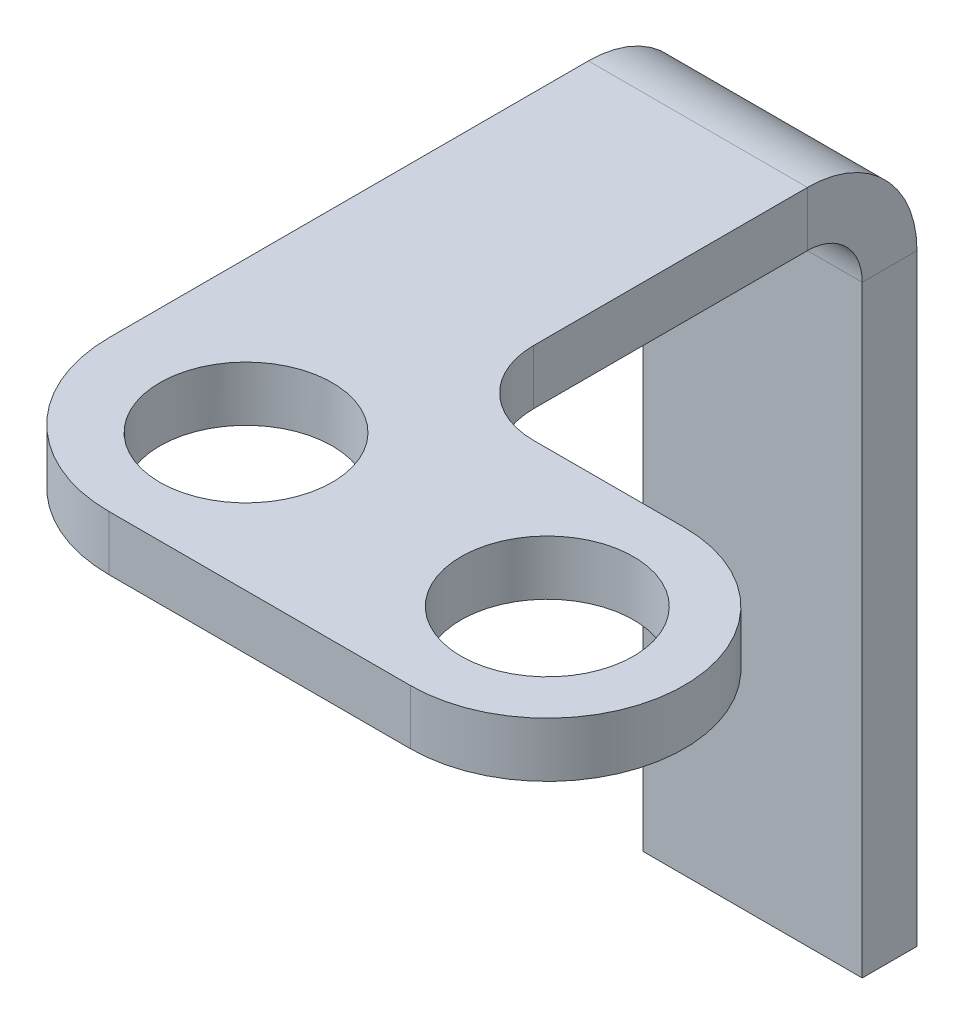
ISO-10303-21;
HEADER;
FILE_DESCRIPTION(('STEP AP214'),'2;1');
FILE_NAME('part.step','',(''),(''),'','','');
FILE_SCHEMA(('AUTOMOTIVE_DESIGN { 1 0 10303 214 1 1 1 1 }'));
ENDSEC;
DATA;
#1=APPLICATION_CONTEXT('core data for automotive mechanical design processes');
#2=APPLICATION_PROTOCOL_DEFINITION('international standard','automotive_design',2000,#1);
#3=PRODUCT_CONTEXT('',#1,'mechanical');
#4=PRODUCT('Part','Part','',(#3));
#5=PRODUCT_RELATED_PRODUCT_CATEGORY('part','',(#4));
#6=PRODUCT_DEFINITION_FORMATION('','',#4);
#7=PRODUCT_DEFINITION_CONTEXT('part definition',#1,'design');
#8=PRODUCT_DEFINITION('design','',#6,#7);
#9=PRODUCT_DEFINITION_SHAPE('','',#8);
#10=(LENGTH_UNIT() NAMED_UNIT(*) SI_UNIT(.MILLI.,.METRE.));
#11=(NAMED_UNIT(*) PLANE_ANGLE_UNIT() SI_UNIT($,.RADIAN.));
#12=(NAMED_UNIT(*) SI_UNIT($,.STERADIAN.) SOLID_ANGLE_UNIT());
#13=UNCERTAINTY_MEASURE_WITH_UNIT(LENGTH_MEASURE(1.E-05),#10,'distance_accuracy_value','');
#14=(GEOMETRIC_REPRESENTATION_CONTEXT(3) GLOBAL_UNCERTAINTY_ASSIGNED_CONTEXT((#13)) GLOBAL_UNIT_ASSIGNED_CONTEXT((#10,
#11,#12)) REPRESENTATION_CONTEXT('',''));
#15=CARTESIAN_POINT('',(0.,0.,0.));
#16=DIRECTION('',(0.,0.,1.));
#17=DIRECTION('',(1.,0.,0.));
#18=AXIS2_PLACEMENT_3D('',#15,#16,#17);
#19=CARTESIAN_POINT('',(8.,-25.,1.));
#20=DIRECTION('',(0.,1.,0.));
#21=DIRECTION('',(-1.,0.,0.));
#22=AXIS2_PLACEMENT_3D('',#19,#20,#21);
#23=PLANE('',#22);
#24=DIRECTION('',(0.,0.,1.));
#25=VECTOR('',#24,1.);
#26=CARTESIAN_POINT('',(0.,-25.,1.));
#27=LINE('',#26,#25);
#28=CARTESIAN_POINT('',(0.,-25.,-1.));
#29=VERTEX_POINT('',#28);
#30=CARTESIAN_POINT('',(0.,-25.,1.));
#31=VERTEX_POINT('',#30);
#32=EDGE_CURVE('E11',#29,#31,#27,.T.);
#33=ORIENTED_EDGE('',*,*,#32,.F.);
#34=DIRECTION('',(1.,0.,0.));
#35=VECTOR('',#34,1.);
#36=CARTESIAN_POINT('',(8.,-25.,-1.));
#37=LINE('',#36,#35);
#38=CARTESIAN_POINT('',(8.,-25.,-1.));
#39=VERTEX_POINT('',#38);
#40=EDGE_CURVE('E105',#39,#29,#37,.F.);
#41=ORIENTED_EDGE('',*,*,#40,.F.);
#42=DIRECTION('',(0.,0.,1.));
#43=VECTOR('',#42,1.);
#44=CARTESIAN_POINT('',(8.,-25.,1.));
#45=LINE('',#44,#43);
#46=CARTESIAN_POINT('',(8.,-25.,1.));
#47=VERTEX_POINT('',#46);
#48=EDGE_CURVE('E54',#39,#47,#45,.T.);
#49=ORIENTED_EDGE('',*,*,#48,.T.);
#50=DIRECTION('',(-1.,0.,0.));
#51=VECTOR('',#50,1.);
#52=CARTESIAN_POINT('',(8.,-25.,1.));
#53=LINE('',#52,#51);
#54=EDGE_CURVE('E107',#47,#31,#53,.T.);
#55=ORIENTED_EDGE('',*,*,#54,.T.);
#56=EDGE_LOOP('',(#33,#41,#49,#55));
#57=FACE_BOUND('',#56,.T.);
#58=ADVANCED_FACE('F44',(#57),#23,.F.);
#59=CARTESIAN_POINT('',(8.,-25.,1.));
#60=DIRECTION('',(1.,0.,0.));
#61=DIRECTION('',(0.,1.,0.));
#62=AXIS2_PLACEMENT_3D('',#59,#60,#61);
#63=PLANE('',#62);
#64=ORIENTED_EDGE('',*,*,#48,.F.);
#65=DIRECTION('',(0.,1.,0.));
#66=VECTOR('',#65,1.);
#67=CARTESIAN_POINT('',(8.,-25.,-1.));
#68=LINE('',#67,#66);
#69=CARTESIAN_POINT('',(8.,-3.00000000000002,-1.));
#70=VERTEX_POINT('',#69);
#71=EDGE_CURVE('E120',#39,#70,#68,.T.);
#72=ORIENTED_EDGE('',*,*,#71,.T.);
#73=DIRECTION('',(0.,0.,1.));
#74=VECTOR('',#73,1.);
#75=CARTESIAN_POINT('',(8.,-3.00000000000001,1.));
#76=LINE('',#75,#74);
#77=CARTESIAN_POINT('',(8.,-3.00000000000001,1.));
#78=VERTEX_POINT('',#77);
#79=EDGE_CURVE('E160',#70,#78,#76,.T.);
#80=ORIENTED_EDGE('',*,*,#79,.T.);
#81=DIRECTION('',(0.,1.,0.));
#82=VECTOR('',#81,1.);
#83=CARTESIAN_POINT('',(8.,-25.,1.));
#84=LINE('',#83,#82);
#85=EDGE_CURVE('E172',#47,#78,#84,.T.);
#86=ORIENTED_EDGE('',*,*,#85,.F.);
#87=EDGE_LOOP('',(#64,#72,#80,#86));
#88=FACE_BOUND('',#87,.T.);
#89=ADVANCED_FACE('F175',(#88),#63,.T.);
#90=CARTESIAN_POINT('',(8.,-3.,3.));
#91=DIRECTION('',(-1.,0.,0.));
#92=DIRECTION('',(0.,0.,1.));
#93=AXIS2_PLACEMENT_3D('',#90,#91,#92);
#94=PLANE('',#93);
#95=ORIENTED_EDGE('',*,*,#79,.F.);
#96=CARTESIAN_POINT('',(8.,-3.,3.));
#97=DIRECTION('',(-1.,0.,0.));
#98=DIRECTION('',(0.,0.,1.));
#99=AXIS2_PLACEMENT_3D('',#96,#97,#98);
#100=CIRCLE('',#99,4.);
#101=CARTESIAN_POINT('',(8.,1.,3.00000000000004));
#102=VERTEX_POINT('',#101);
#103=EDGE_CURVE('E223',#70,#102,#100,.F.);
#104=ORIENTED_EDGE('',*,*,#103,.T.);
#105=DIRECTION('',(0.,-1.,0.));
#106=VECTOR('',#105,1.);
#107=CARTESIAN_POINT('',(8.,-1.,3.00000000000002));
#108=LINE('',#107,#106);
#109=CARTESIAN_POINT('',(8.,-1.,3.00000000000002));
#110=VERTEX_POINT('',#109);
#111=EDGE_CURVE('E62',#102,#110,#108,.T.);
#112=ORIENTED_EDGE('',*,*,#111,.T.);
#113=CARTESIAN_POINT('',(8.,-3.,3.));
#114=DIRECTION('',(1.,0.,0.));
#115=DIRECTION('',(0.,0.,-1.));
#116=AXIS2_PLACEMENT_3D('',#113,#114,#115);
#117=CIRCLE('',#116,2.);
#118=EDGE_CURVE('E214',#78,#110,#117,.T.);
#119=ORIENTED_EDGE('',*,*,#118,.F.);
#120=EDGE_LOOP('',(#95,#104,#112,#119));
#121=FACE_BOUND('',#120,.T.);
#122=ADVANCED_FACE('F248',(#121),#94,.F.);
#123=CARTESIAN_POINT('',(8.,-1.,3.00000000000002));
#124=DIRECTION('',(1.,0.,0.));
#125=DIRECTION('',(0.,0.,1.));
#126=AXIS2_PLACEMENT_3D('',#123,#124,#125);
#127=PLANE('',#126);
#128=ORIENTED_EDGE('',*,*,#111,.F.);
#129=DIRECTION('',(0.,0.,-1.));
#130=VECTOR('',#129,1.);
#131=CARTESIAN_POINT('',(8.,1.,3.00000000000002));
#132=LINE('',#131,#130);
#133=CARTESIAN_POINT('',(8.,0.999999999999999,13.));
#134=VERTEX_POINT('',#133);
#135=EDGE_CURVE('E132',#102,#134,#132,.F.);
#136=ORIENTED_EDGE('',*,*,#135,.T.);
#137=DIRECTION('',(0.,-1.,0.));
#138=VECTOR('',#137,1.);
#139=CARTESIAN_POINT('',(8.,-1.,13.));
#140=LINE('',#139,#138);
#141=CARTESIAN_POINT('',(8.,-1.,13.));
#142=VERTEX_POINT('',#141);
#143=EDGE_CURVE('E156',#134,#142,#140,.T.);
#144=ORIENTED_EDGE('',*,*,#143,.T.);
#145=DIRECTION('',(0.,0.,1.));
#146=VECTOR('',#145,1.);
#147=CARTESIAN_POINT('',(8.,-1.,3.00000000000002));
#148=LINE('',#147,#146);
#149=EDGE_CURVE('E184',#110,#142,#148,.T.);
#150=ORIENTED_EDGE('',*,*,#149,.F.);
#151=EDGE_LOOP('',(#128,#136,#144,#150));
#152=FACE_BOUND('',#151,.T.);
#153=ADVANCED_FACE('F287',(#152),#127,.T.);
#154=CARTESIAN_POINT('',(11.,-1.,13.));
#155=DIRECTION('',(0.,-1.,0.));
#156=DIRECTION('',(0.,0.,-1.));
#157=AXIS2_PLACEMENT_3D('',#154,#155,#156);
#158=CYLINDRICAL_SURFACE('',#157,3.);
#159=ORIENTED_EDGE('',*,*,#143,.F.);
#160=CARTESIAN_POINT('',(11.,0.999999999999999,13.));
#161=DIRECTION('',(0.,-1.,0.));
#162=DIRECTION('',(0.,0.,-1.));
#163=AXIS2_PLACEMENT_3D('',#160,#161,#162);
#164=CIRCLE('',#163,3.);
#165=CARTESIAN_POINT('',(11.,0.999999999999999,16.));
#166=VERTEX_POINT('',#165);
#167=EDGE_CURVE('E238',#166,#134,#164,.T.);
#168=ORIENTED_EDGE('',*,*,#167,.F.);
#169=DIRECTION('',(0.,-1.,0.));
#170=VECTOR('',#169,1.);
#171=CARTESIAN_POINT('',(11.,-1.,16.));
#172=LINE('',#171,#170);
#173=CARTESIAN_POINT('',(11.,-1.,16.));
#174=VERTEX_POINT('',#173);
#175=EDGE_CURVE('E153',#166,#174,#172,.T.);
#176=ORIENTED_EDGE('',*,*,#175,.T.);
#177=CARTESIAN_POINT('',(11.,-1.,13.));
#178=DIRECTION('',(0.,-1.,0.));
#179=DIRECTION('',(0.,0.,-1.));
#180=AXIS2_PLACEMENT_3D('',#177,#178,#179);
#181=CIRCLE('',#180,3.);
#182=EDGE_CURVE('E187',#174,#142,#181,.T.);
#183=ORIENTED_EDGE('',*,*,#182,.T.);
#184=EDGE_LOOP('',(#159,#168,#176,#183));
#185=FACE_BOUND('',#184,.T.);
#186=ADVANCED_FACE('F291',(#185),#158,.F.);
#187=CARTESIAN_POINT('',(11.,-1.,16.));
#188=DIRECTION('',(0.,0.,1.));
#189=DIRECTION('',(-1.,0.,0.));
#190=AXIS2_PLACEMENT_3D('',#187,#188,#189);
#191=PLANE('',#190);
#192=ORIENTED_EDGE('',*,*,#175,.F.);
#193=DIRECTION('',(1.,0.,0.));
#194=VECTOR('',#193,1.);
#195=CARTESIAN_POINT('',(8.,0.999999999999999,16.));
#196=LINE('',#195,#194);
#197=CARTESIAN_POINT('',(16.5,0.999999999999999,16.));
#198=VERTEX_POINT('',#197);
#199=EDGE_CURVE('E235',#198,#166,#196,.F.);
#200=ORIENTED_EDGE('',*,*,#199,.F.);
#201=DIRECTION('',(0.,-1.,0.));
#202=VECTOR('',#201,1.);
#203=CARTESIAN_POINT('',(16.5,-1.,16.));
#204=LINE('',#203,#202);
#205=CARTESIAN_POINT('',(16.5,-1.,16.));
#206=VERTEX_POINT('',#205);
#207=EDGE_CURVE('E150',#198,#206,#204,.T.);
#208=ORIENTED_EDGE('',*,*,#207,.T.);
#209=DIRECTION('',(-1.,0.,0.));
#210=VECTOR('',#209,1.);
#211=CARTESIAN_POINT('',(11.,-1.,16.));
#212=LINE('',#211,#210);
#213=EDGE_CURVE('E190',#206,#174,#212,.T.);
#214=ORIENTED_EDGE('',*,*,#213,.T.);
#215=EDGE_LOOP('',(#192,#200,#208,#214));
#216=FACE_BOUND('',#215,.T.);
#217=ADVANCED_FACE('F294',(#216),#191,.F.);
#218=CARTESIAN_POINT('',(16.5,-1.,21.));
#219=DIRECTION('',(0.,1.,0.));
#220=DIRECTION('',(0.,0.,1.));
#221=AXIS2_PLACEMENT_3D('',#218,#219,#220);
#222=CYLINDRICAL_SURFACE('',#221,5.);
#223=ORIENTED_EDGE('',*,*,#207,.F.);
#224=CARTESIAN_POINT('',(16.5,0.999999999999998,21.));
#225=DIRECTION('',(0.,1.,0.));
#226=DIRECTION('',(0.,0.,1.));
#227=AXIS2_PLACEMENT_3D('',#224,#225,#226);
#228=CIRCLE('',#227,5.);
#229=CARTESIAN_POINT('',(16.5,0.999999999999997,26.));
#230=VERTEX_POINT('',#229);
#231=EDGE_CURVE('E232',#230,#198,#228,.T.);
#232=ORIENTED_EDGE('',*,*,#231,.F.);
#233=DIRECTION('',(0.,-1.,0.));
#234=VECTOR('',#233,1.);
#235=CARTESIAN_POINT('',(16.5,-1.,26.));
#236=LINE('',#235,#234);
#237=CARTESIAN_POINT('',(16.5,-1.,26.));
#238=VERTEX_POINT('',#237);
#239=EDGE_CURVE('E147',#230,#238,#236,.T.);
#240=ORIENTED_EDGE('',*,*,#239,.T.);
#241=CARTESIAN_POINT('',(16.5,-1.,21.));
#242=DIRECTION('',(0.,1.,0.));
#243=DIRECTION('',(0.,0.,1.));
#244=AXIS2_PLACEMENT_3D('',#241,#242,#243);
#245=CIRCLE('',#244,5.);
#246=EDGE_CURVE('E193',#238,#206,#245,.T.);
#247=ORIENTED_EDGE('',*,*,#246,.T.);
#248=EDGE_LOOP('',(#223,#232,#240,#247));
#249=FACE_BOUND('',#248,.T.);
#250=ADVANCED_FACE('F298',(#249),#222,.T.);
#251=CARTESIAN_POINT('',(5.5,-1.,26.));
#252=DIRECTION('',(0.,0.,-1.));
#253=DIRECTION('',(1.,0.,0.));
#254=AXIS2_PLACEMENT_3D('',#251,#252,#253);
#255=PLANE('',#254);
#256=ORIENTED_EDGE('',*,*,#239,.F.);
#257=DIRECTION('',(1.,0.,0.));
#258=VECTOR('',#257,1.);
#259=CARTESIAN_POINT('',(8.,0.999999999999997,26.));
#260=LINE('',#259,#258);
#261=CARTESIAN_POINT('',(5.5,0.999999999999997,26.));
#262=VERTEX_POINT('',#261);
#263=EDGE_CURVE('E229',#262,#230,#260,.T.);
#264=ORIENTED_EDGE('',*,*,#263,.F.);
#265=DIRECTION('',(0.,-1.,0.));
#266=VECTOR('',#265,1.);
#267=CARTESIAN_POINT('',(5.5,-1.,26.));
#268=LINE('',#267,#266);
#269=CARTESIAN_POINT('',(5.5,-1.,26.));
#270=VERTEX_POINT('',#269);
#271=EDGE_CURVE('E144',#262,#270,#268,.T.);
#272=ORIENTED_EDGE('',*,*,#271,.T.);
#273=DIRECTION('',(1.,0.,0.));
#274=VECTOR('',#273,1.);
#275=CARTESIAN_POINT('',(5.5,-1.,26.));
#276=LINE('',#275,#274);
#277=EDGE_CURVE('E196',#270,#238,#276,.T.);
#278=ORIENTED_EDGE('',*,*,#277,.T.);
#279=EDGE_LOOP('',(#256,#264,#272,#278));
#280=FACE_BOUND('',#279,.T.);
#281=ADVANCED_FACE('F300',(#280),#255,.F.);
#282=CARTESIAN_POINT('',(5.5,-1.,20.5));
#283=DIRECTION('',(0.,1.,0.));
#284=DIRECTION('',(0.,0.,1.));
#285=AXIS2_PLACEMENT_3D('',#282,#283,#284);
#286=CYLINDRICAL_SURFACE('',#285,5.5);
#287=ORIENTED_EDGE('',*,*,#271,.F.);
#288=CARTESIAN_POINT('',(5.5,0.999999999999998,20.5));
#289=DIRECTION('',(0.,1.,0.));
#290=DIRECTION('',(0.,0.,1.));
#291=AXIS2_PLACEMENT_3D('',#288,#289,#290);
#292=CIRCLE('',#291,5.5);
#293=CARTESIAN_POINT('',(0.,0.999999999999998,20.5));
#294=VERTEX_POINT('',#293);
#295=EDGE_CURVE('E226',#294,#262,#292,.T.);
#296=ORIENTED_EDGE('',*,*,#295,.F.);
#297=DIRECTION('',(0.,-1.,0.));
#298=VECTOR('',#297,1.);
#299=CARTESIAN_POINT('',(0.,-1.,20.5));
#300=LINE('',#299,#298);
#301=CARTESIAN_POINT('',(0.,-1.,20.5));
#302=VERTEX_POINT('',#301);
#303=EDGE_CURVE('E141',#294,#302,#300,.T.);
#304=ORIENTED_EDGE('',*,*,#303,.T.);
#305=CARTESIAN_POINT('',(5.5,-1.,20.5));
#306=DIRECTION('',(0.,1.,0.));
#307=DIRECTION('',(0.,0.,-1.));
#308=AXIS2_PLACEMENT_3D('',#305,#306,#307);
#309=CIRCLE('',#308,5.5);
#310=EDGE_CURVE('E199',#302,#270,#309,.T.);
#311=ORIENTED_EDGE('',*,*,#310,.T.);
#312=EDGE_LOOP('',(#287,#296,#304,#311));
#313=FACE_BOUND('',#312,.T.);
#314=ADVANCED_FACE('F271',(#313),#286,.T.);
#315=CARTESIAN_POINT('',(0.,-1.,3.00000000000002));
#316=DIRECTION('',(1.,0.,0.));
#317=DIRECTION('',(0.,0.,1.));
#318=AXIS2_PLACEMENT_3D('',#315,#316,#317);
#319=PLANE('',#318);
#320=ORIENTED_EDGE('',*,*,#303,.F.);
#321=DIRECTION('',(0.,0.,-1.));
#322=VECTOR('',#321,1.);
#323=CARTESIAN_POINT('',(0.,1.,3.00000000000002));
#324=LINE('',#323,#322);
#325=CARTESIAN_POINT('',(0.,1.,3.00000000000002));
#326=VERTEX_POINT('',#325);
#327=EDGE_CURVE('E220',#326,#294,#324,.F.);
#328=ORIENTED_EDGE('',*,*,#327,.F.);
#329=DIRECTION('',(0.,-1.,0.));
#330=VECTOR('',#329,1.);
#331=CARTESIAN_POINT('',(0.,-1.,3.00000000000002));
#332=LINE('',#331,#330);
#333=CARTESIAN_POINT('',(0.,-1.,3.00000000000002));
#334=VERTEX_POINT('',#333);
#335=EDGE_CURVE('E139',#326,#334,#332,.T.);
#336=ORIENTED_EDGE('',*,*,#335,.T.);
#337=DIRECTION('',(0.,0.,1.));
#338=VECTOR('',#337,1.);
#339=CARTESIAN_POINT('',(0.,-1.,3.00000000000002));
#340=LINE('',#339,#338);
#341=EDGE_CURVE('E202',#334,#302,#340,.T.);
#342=ORIENTED_EDGE('',*,*,#341,.T.);
#343=EDGE_LOOP('',(#320,#328,#336,#342));
#344=FACE_BOUND('',#343,.T.);
#345=ADVANCED_FACE('F280',(#344),#319,.F.);
#346=CARTESIAN_POINT('',(0.,-3.,3.));
#347=DIRECTION('',(-1.,0.,0.));
#348=DIRECTION('',(0.,0.,1.));
#349=AXIS2_PLACEMENT_3D('',#346,#347,#348);
#350=PLANE('',#349);
#351=ORIENTED_EDGE('',*,*,#335,.F.);
#352=CARTESIAN_POINT('',(0.,-3.,3.));
#353=DIRECTION('',(-1.,0.,0.));
#354=DIRECTION('',(0.,0.,1.));
#355=AXIS2_PLACEMENT_3D('',#352,#353,#354);
#356=CIRCLE('',#355,4.);
#357=CARTESIAN_POINT('',(0.,-3.00000000000003,-1.));
#358=VERTEX_POINT('',#357);
#359=EDGE_CURVE('E137',#358,#326,#356,.F.);
#360=ORIENTED_EDGE('',*,*,#359,.F.);
#361=DIRECTION('',(0.,0.,1.));
#362=VECTOR('',#361,1.);
#363=CARTESIAN_POINT('',(0.,-3.00000000000001,1.));
#364=LINE('',#363,#362);
#365=CARTESIAN_POINT('',(0.,-3.00000000000001,1.));
#366=VERTEX_POINT('',#365);
#367=EDGE_CURVE('E48',#358,#366,#364,.T.);
#368=ORIENTED_EDGE('',*,*,#367,.T.);
#369=CARTESIAN_POINT('',(0.,-3.,3.));
#370=DIRECTION('',(1.,0.,0.));
#371=DIRECTION('',(0.,0.,-1.));
#372=AXIS2_PLACEMENT_3D('',#369,#370,#371);
#373=CIRCLE('',#372,2.);
#374=EDGE_CURVE('E211',#366,#334,#373,.T.);
#375=ORIENTED_EDGE('',*,*,#374,.T.);
#376=EDGE_LOOP('',(#351,#360,#368,#375));
#377=FACE_BOUND('',#376,.T.);
#378=ADVANCED_FACE('F281',(#377),#350,.T.);
#379=CARTESIAN_POINT('',(5.5,-1.,21.));
#380=DIRECTION('',(0.,1.,0.));
#381=DIRECTION('',(0.,0.,1.));
#382=AXIS2_PLACEMENT_3D('',#379,#380,#381);
#383=CYLINDRICAL_SURFACE('',#382,3.15);
#384=CARTESIAN_POINT('',(5.5,-1.,21.));
#385=DIRECTION('',(0.,1.,0.));
#386=DIRECTION('',(0.,0.,-1.));
#387=AXIS2_PLACEMENT_3D('',#384,#385,#386);
#388=CIRCLE('',#387,3.15);
#389=CARTESIAN_POINT('',(5.5,-1.,17.85));
#390=VERTEX_POINT('',#389);
#391=EDGE_CURVE('E178',#390,#390,#388,.T.);
#392=ORIENTED_EDGE('',*,*,#391,.F.);
#393=EDGE_LOOP('',(#392));
#394=FACE_BOUND('',#393,.T.);
#395=CARTESIAN_POINT('',(5.5,0.999999999999998,21.));
#396=DIRECTION('',(0.,1.,0.));
#397=DIRECTION('',(0.,0.,1.));
#398=AXIS2_PLACEMENT_3D('',#395,#396,#397);
#399=CIRCLE('',#398,3.15);
#400=CARTESIAN_POINT('',(5.5,0.999999999999997,24.15));
#401=VERTEX_POINT('',#400);
#402=EDGE_CURVE('E129',#401,#401,#399,.T.);
#403=ORIENTED_EDGE('',*,*,#402,.T.);
#404=EDGE_LOOP('',(#403));
#405=FACE_BOUND('',#404,.T.);
#406=ADVANCED_FACE('F318',(#394,#405),#383,.F.);
#407=CARTESIAN_POINT('',(16.5,-1.,21.));
#408=DIRECTION('',(0.,1.,0.));
#409=DIRECTION('',(0.,0.,1.));
#410=AXIS2_PLACEMENT_3D('',#407,#408,#409);
#411=CYLINDRICAL_SURFACE('',#410,3.15);
#412=CARTESIAN_POINT('',(16.5,-1.,21.));
#413=DIRECTION('',(0.,1.,0.));
#414=DIRECTION('',(0.,0.,1.));
#415=AXIS2_PLACEMENT_3D('',#412,#413,#414);
#416=CIRCLE('',#415,3.15);
#417=CARTESIAN_POINT('',(16.5,-1.,24.15));
#418=VERTEX_POINT('',#417);
#419=EDGE_CURVE('E208',#418,#418,#416,.T.);
#420=ORIENTED_EDGE('',*,*,#419,.F.);
#421=EDGE_LOOP('',(#420));
#422=FACE_BOUND('',#421,.T.);
#423=CARTESIAN_POINT('',(16.5,0.999999999999998,21.));
#424=DIRECTION('',(0.,1.,0.));
#425=DIRECTION('',(0.,0.,1.));
#426=AXIS2_PLACEMENT_3D('',#423,#424,#425);
#427=CIRCLE('',#426,3.15);
#428=CARTESIAN_POINT('',(16.5,0.999999999999997,24.15));
#429=VERTEX_POINT('',#428);
#430=EDGE_CURVE('E134',#429,#429,#427,.T.);
#431=ORIENTED_EDGE('',*,*,#430,.T.);
#432=EDGE_LOOP('',(#431));
#433=FACE_BOUND('',#432,.T.);
#434=ADVANCED_FACE('F46',(#422,#433),#411,.F.);
#435=CARTESIAN_POINT('',(0.,-25.,1.));
#436=DIRECTION('',(1.,0.,0.));
#437=DIRECTION('',(0.,1.,0.));
#438=AXIS2_PLACEMENT_3D('',#435,#436,#437);
#439=PLANE('',#438);
#440=DIRECTION('',(0.,1.,0.));
#441=VECTOR('',#440,1.);
#442=CARTESIAN_POINT('',(0.,-25.,-1.));
#443=LINE('',#442,#441);
#444=EDGE_CURVE('E117',#29,#358,#443,.T.);
#445=ORIENTED_EDGE('',*,*,#444,.F.);
#446=ORIENTED_EDGE('',*,*,#32,.T.);
#447=DIRECTION('',(0.,1.,0.));
#448=VECTOR('',#447,1.);
#449=CARTESIAN_POINT('',(0.,-25.,1.));
#450=LINE('',#449,#448);
#451=EDGE_CURVE('E173',#31,#366,#450,.T.);
#452=ORIENTED_EDGE('',*,*,#451,.T.);
#453=ORIENTED_EDGE('',*,*,#367,.F.);
#454=EDGE_LOOP('',(#445,#446,#452,#453));
#455=FACE_BOUND('',#454,.T.);
#456=ADVANCED_FACE('F123',(#455),#439,.F.);
#457=CARTESIAN_POINT('',(8.,-3.,3.));
#458=DIRECTION('',(-1.,0.,0.));
#459=DIRECTION('',(0.,0.,1.));
#460=AXIS2_PLACEMENT_3D('',#457,#458,#459);
#461=CYLINDRICAL_SURFACE('',#460,2.);
#462=ORIENTED_EDGE('',*,*,#374,.F.);
#463=DIRECTION('',(-1.,0.,0.));
#464=VECTOR('',#463,1.);
#465=CARTESIAN_POINT('',(8.,-3.00000000000001,1.));
#466=LINE('',#465,#464);
#467=EDGE_CURVE('E176',#78,#366,#466,.T.);
#468=ORIENTED_EDGE('',*,*,#467,.F.);
#469=ORIENTED_EDGE('',*,*,#118,.T.);
#470=DIRECTION('',(-1.,0.,0.));
#471=VECTOR('',#470,1.);
#472=CARTESIAN_POINT('',(8.,-1.,3.00000000000002));
#473=LINE('',#472,#471);
#474=EDGE_CURVE('E205',#110,#334,#473,.T.);
#475=ORIENTED_EDGE('',*,*,#474,.T.);
#476=EDGE_LOOP('',(#462,#468,#469,#475));
#477=FACE_BOUND('',#476,.T.);
#478=ADVANCED_FACE('F255',(#477),#461,.F.);
#479=CARTESIAN_POINT('',(8.,-1.,3.00000000000002));
#480=DIRECTION('',(0.,-1.,0.));
#481=DIRECTION('',(0.,0.,-1.));
#482=AXIS2_PLACEMENT_3D('',#479,#480,#481);
#483=PLANE('',#482);
#484=ORIENTED_EDGE('',*,*,#391,.T.);
#485=EDGE_LOOP('',(#484));
#486=FACE_BOUND('',#485,.T.);
#487=ORIENTED_EDGE('',*,*,#149,.T.);
#488=ORIENTED_EDGE('',*,*,#182,.F.);
#489=ORIENTED_EDGE('',*,*,#213,.F.);
#490=ORIENTED_EDGE('',*,*,#246,.F.);
#491=ORIENTED_EDGE('',*,*,#277,.F.);
#492=ORIENTED_EDGE('',*,*,#310,.F.);
#493=ORIENTED_EDGE('',*,*,#341,.F.);
#494=ORIENTED_EDGE('',*,*,#474,.F.);
#495=EDGE_LOOP('',(#487,#488,#489,#490,#491,#492,#493,#494));
#496=FACE_BOUND('',#495,.T.);
#497=ORIENTED_EDGE('',*,*,#419,.T.);
#498=EDGE_LOOP('',(#497));
#499=FACE_BOUND('',#498,.T.);
#500=ADVANCED_FACE('F277',(#486,#496,#499),#483,.T.);
#501=CARTESIAN_POINT('',(8.,-25.,1.));
#502=DIRECTION('',(0.,0.,1.));
#503=DIRECTION('',(1.,0.,0.));
#504=AXIS2_PLACEMENT_3D('',#501,#502,#503);
#505=PLANE('',#504);
#506=ORIENTED_EDGE('',*,*,#451,.F.);
#507=ORIENTED_EDGE('',*,*,#54,.F.);
#508=ORIENTED_EDGE('',*,*,#85,.T.);
#509=ORIENTED_EDGE('',*,*,#467,.T.);
#510=EDGE_LOOP('',(#506,#507,#508,#509));
#511=FACE_BOUND('',#510,.T.);
#512=ADVANCED_FACE('F170',(#511),#505,.T.);
#513=CARTESIAN_POINT('',(8.,-3.,3.));
#514=DIRECTION('',(-1.,0.,0.));
#515=DIRECTION('',(0.,0.,1.));
#516=AXIS2_PLACEMENT_3D('',#513,#514,#515);
#517=CYLINDRICAL_SURFACE('',#516,4.);
#518=ORIENTED_EDGE('',*,*,#359,.T.);
#519=DIRECTION('',(-1.,0.,0.));
#520=VECTOR('',#519,1.);
#521=CARTESIAN_POINT('',(8.,1.,3.00000000000004));
#522=LINE('',#521,#520);
#523=EDGE_CURVE('E138',#102,#326,#522,.T.);
#524=ORIENTED_EDGE('',*,*,#523,.F.);
#525=ORIENTED_EDGE('',*,*,#103,.F.);
#526=DIRECTION('',(1.,0.,0.));
#527=VECTOR('',#526,1.);
#528=CARTESIAN_POINT('',(8.,-3.00000000000002,-1.));
#529=LINE('',#528,#527);
#530=EDGE_CURVE('E133',#70,#358,#529,.F.);
#531=ORIENTED_EDGE('',*,*,#530,.T.);
#532=EDGE_LOOP('',(#518,#524,#525,#531));
#533=FACE_BOUND('',#532,.T.);
#534=ADVANCED_FACE('F246',(#533),#517,.T.);
#535=CARTESIAN_POINT('',(8.,1.,3.00000000000002));
#536=DIRECTION('',(0.,-1.,0.));
#537=DIRECTION('',(0.,0.,-1.));
#538=AXIS2_PLACEMENT_3D('',#535,#536,#537);
#539=PLANE('',#538);
#540=ORIENTED_EDGE('',*,*,#402,.F.);
#541=EDGE_LOOP('',(#540));
#542=FACE_BOUND('',#541,.T.);
#543=ORIENTED_EDGE('',*,*,#135,.F.);
#544=ORIENTED_EDGE('',*,*,#523,.T.);
#545=ORIENTED_EDGE('',*,*,#327,.T.);
#546=ORIENTED_EDGE('',*,*,#295,.T.);
#547=ORIENTED_EDGE('',*,*,#263,.T.);
#548=ORIENTED_EDGE('',*,*,#231,.T.);
#549=ORIENTED_EDGE('',*,*,#199,.T.);
#550=ORIENTED_EDGE('',*,*,#167,.T.);
#551=EDGE_LOOP('',(#543,#544,#545,#546,#547,#548,#549,#550));
#552=FACE_BOUND('',#551,.T.);
#553=ORIENTED_EDGE('',*,*,#430,.F.);
#554=EDGE_LOOP('',(#553));
#555=FACE_BOUND('',#554,.T.);
#556=ADVANCED_FACE('F283',(#542,#552,#555),#539,.F.);
#557=CARTESIAN_POINT('',(8.,-25.,-1.));
#558=DIRECTION('',(0.,0.,1.));
#559=DIRECTION('',(1.,0.,0.));
#560=AXIS2_PLACEMENT_3D('',#557,#558,#559);
#561=PLANE('',#560);
#562=ORIENTED_EDGE('',*,*,#444,.T.);
#563=ORIENTED_EDGE('',*,*,#530,.F.);
#564=ORIENTED_EDGE('',*,*,#71,.F.);
#565=ORIENTED_EDGE('',*,*,#40,.T.);
#566=EDGE_LOOP('',(#562,#563,#564,#565));
#567=FACE_BOUND('',#566,.T.);
#568=ADVANCED_FACE('F115',(#567),#561,.F.);
#569=CLOSED_SHELL('',(#58,#89,#122,#153,#186,#217,#250,#281,#314,#345,#378,#406,#434,#456,#478,
#500,#512,#534,#556,#568));
#570=MANIFOLD_SOLID_BREP('B2',#569);
#571=ADVANCED_BREP_SHAPE_REPRESENTATION('',(#18,#570),#14);
#572=SHAPE_DEFINITION_REPRESENTATION(#9,#571);
ENDSEC;
END-ISO-10303-21;
